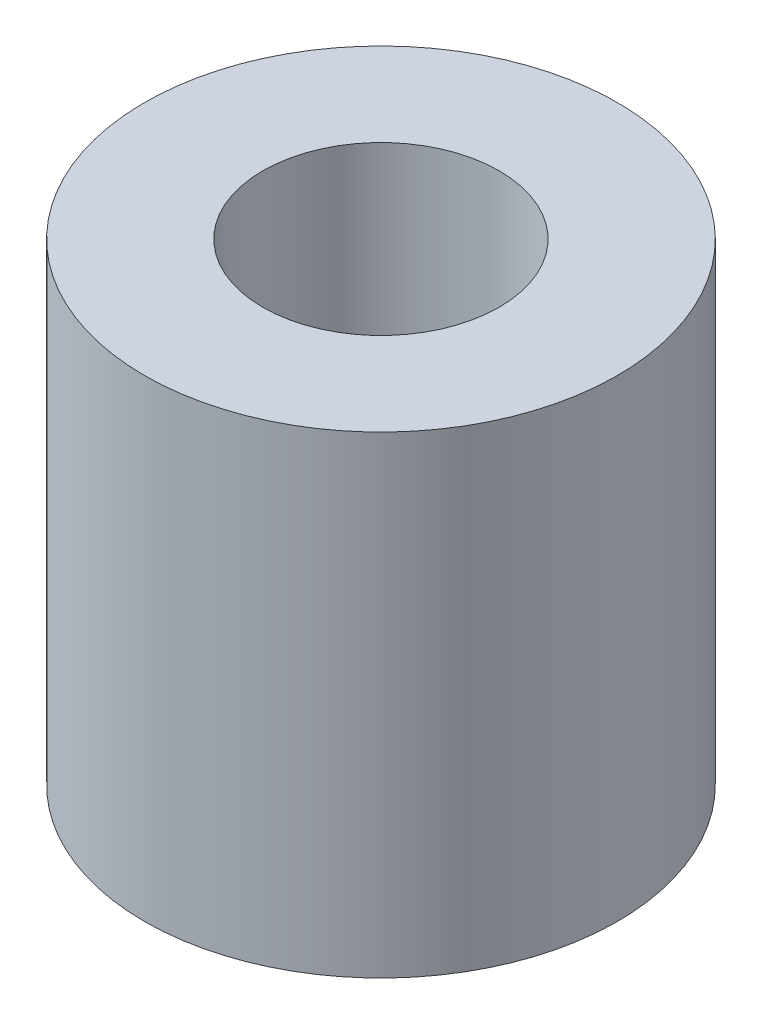
ISO-10303-21;
HEADER;
FILE_DESCRIPTION(('STEP AP214'),'2;1');
FILE_NAME('part.step','',(''),(''),'','','');
FILE_SCHEMA(('AUTOMOTIVE_DESIGN { 1 0 10303 214 1 1 1 1 }'));
ENDSEC;
DATA;
#1=APPLICATION_CONTEXT('core data for automotive mechanical design processes');
#2=APPLICATION_PROTOCOL_DEFINITION('international standard','automotive_design',2000,#1);
#3=PRODUCT_CONTEXT('',#1,'mechanical');
#4=PRODUCT('Part','Part','',(#3));
#5=PRODUCT_RELATED_PRODUCT_CATEGORY('part','',(#4));
#6=PRODUCT_DEFINITION_FORMATION('','',#4);
#7=PRODUCT_DEFINITION_CONTEXT('part definition',#1,'design');
#8=PRODUCT_DEFINITION('design','',#6,#7);
#9=PRODUCT_DEFINITION_SHAPE('','',#8);
#10=(LENGTH_UNIT() NAMED_UNIT(*) SI_UNIT(.MILLI.,.METRE.));
#11=(NAMED_UNIT(*) PLANE_ANGLE_UNIT() SI_UNIT($,.RADIAN.));
#12=(NAMED_UNIT(*) SI_UNIT($,.STERADIAN.) SOLID_ANGLE_UNIT());
#13=UNCERTAINTY_MEASURE_WITH_UNIT(LENGTH_MEASURE(1.E-05),#10,'distance_accuracy_value','');
#14=(GEOMETRIC_REPRESENTATION_CONTEXT(3) GLOBAL_UNCERTAINTY_ASSIGNED_CONTEXT((#13)) GLOBAL_UNIT_ASSIGNED_CONTEXT((#10,
#11,#12)) REPRESENTATION_CONTEXT('',''));
#15=CARTESIAN_POINT('',(0.,0.,0.));
#16=DIRECTION('',(0.,0.,1.));
#17=DIRECTION('',(1.,0.,0.));
#18=AXIS2_PLACEMENT_3D('',#15,#16,#17);
#19=CARTESIAN_POINT('',(0.,4.,0.));
#20=DIRECTION('',(0.,1.,0.));
#21=DIRECTION('',(0.,0.,1.));
#22=AXIS2_PLACEMENT_3D('',#19,#20,#21);
#23=PLANE('',#22);
#24=CARTESIAN_POINT('',(0.,4.,0.));
#25=DIRECTION('',(0.,1.,0.));
#26=DIRECTION('',(0.,0.,1.));
#27=AXIS2_PLACEMENT_3D('',#24,#25,#26);
#28=CIRCLE('',#27,2.);
#29=CARTESIAN_POINT('',(0.,4.,2.));
#30=VERTEX_POINT('',#29);
#31=EDGE_CURVE('E10',#30,#30,#28,.T.);
#32=ORIENTED_EDGE('',*,*,#31,.T.);
#33=EDGE_LOOP('',(#32));
#34=FACE_BOUND('',#33,.T.);
#35=CARTESIAN_POINT('',(0.,4.,0.));
#36=DIRECTION('',(0.,1.,0.));
#37=DIRECTION('',(0.,0.,1.));
#38=AXIS2_PLACEMENT_3D('',#35,#36,#37);
#39=CIRCLE('',#38,1.);
#40=CARTESIAN_POINT('',(0.,4.,1.));
#41=VERTEX_POINT('',#40);
#42=EDGE_CURVE('E48',#41,#41,#39,.T.);
#43=ORIENTED_EDGE('',*,*,#42,.F.);
#44=EDGE_LOOP('',(#43));
#45=FACE_BOUND('',#44,.T.);
#46=ADVANCED_FACE('F35',(#34,#45),#23,.T.);
#47=CARTESIAN_POINT('',(0.,0.,0.));
#48=DIRECTION('',(0.,1.,0.));
#49=DIRECTION('',(0.,0.,1.));
#50=AXIS2_PLACEMENT_3D('',#47,#48,#49);
#51=PLANE('',#50);
#52=CARTESIAN_POINT('',(0.,0.,0.));
#53=DIRECTION('',(0.,1.,0.));
#54=DIRECTION('',(0.,0.,1.));
#55=AXIS2_PLACEMENT_3D('',#52,#53,#54);
#56=CIRCLE('',#55,2.);
#57=CARTESIAN_POINT('',(0.,0.,2.));
#58=VERTEX_POINT('',#57);
#59=EDGE_CURVE('E39',#58,#58,#56,.T.);
#60=ORIENTED_EDGE('',*,*,#59,.F.);
#61=EDGE_LOOP('',(#60));
#62=FACE_BOUND('',#61,.T.);
#63=CARTESIAN_POINT('',(0.,0.,0.));
#64=DIRECTION('',(0.,1.,0.));
#65=DIRECTION('',(0.,0.,1.));
#66=AXIS2_PLACEMENT_3D('',#63,#64,#65);
#67=CIRCLE('',#66,1.);
#68=CARTESIAN_POINT('',(0.,0.,1.));
#69=VERTEX_POINT('',#68);
#70=EDGE_CURVE('E50',#69,#69,#67,.T.);
#71=ORIENTED_EDGE('',*,*,#70,.T.);
#72=EDGE_LOOP('',(#71));
#73=FACE_BOUND('',#72,.T.);
#74=ADVANCED_FACE('F62',(#62,#73),#51,.F.);
#75=CARTESIAN_POINT('',(0.,4.,0.));
#76=DIRECTION('',(0.,-1.,0.));
#77=DIRECTION('',(0.,0.,-1.));
#78=AXIS2_PLACEMENT_3D('',#75,#76,#77);
#79=CYLINDRICAL_SURFACE('',#78,2.);
#80=ORIENTED_EDGE('',*,*,#31,.F.);
#81=EDGE_LOOP('',(#80));
#82=FACE_BOUND('',#81,.T.);
#83=ORIENTED_EDGE('',*,*,#59,.T.);
#84=EDGE_LOOP('',(#83));
#85=FACE_BOUND('',#84,.T.);
#86=ADVANCED_FACE('F37',(#82,#85),#79,.T.);
#87=CARTESIAN_POINT('',(0.,4.,0.));
#88=DIRECTION('',(0.,-1.,0.));
#89=DIRECTION('',(0.,0.,-1.));
#90=AXIS2_PLACEMENT_3D('',#87,#88,#89);
#91=CYLINDRICAL_SURFACE('',#90,1.);
#92=ORIENTED_EDGE('',*,*,#42,.T.);
#93=EDGE_LOOP('',(#92));
#94=FACE_BOUND('',#93,.T.);
#95=ORIENTED_EDGE('',*,*,#70,.F.);
#96=EDGE_LOOP('',(#95));
#97=FACE_BOUND('',#96,.T.);
#98=ADVANCED_FACE('F58',(#94,#97),#91,.F.);
#99=CLOSED_SHELL('',(#46,#74,#86,#98));
#100=MANIFOLD_SOLID_BREP('B2',#99);
#101=ADVANCED_BREP_SHAPE_REPRESENTATION('',(#18,#100),#14);
#102=SHAPE_DEFINITION_REPRESENTATION(#9,#101);
ENDSEC;
END-ISO-10303-21;
